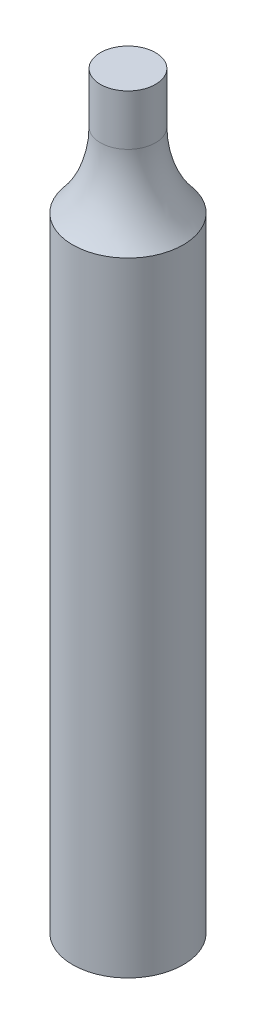
ISO-10303-21;
HEADER;
FILE_DESCRIPTION(('STEP AP214'),'2;1');
FILE_NAME('part.step','',(''),(''),'','','');
FILE_SCHEMA(('AUTOMOTIVE_DESIGN { 1 0 10303 214 1 1 1 1 }'));
ENDSEC;
DATA;
#1=APPLICATION_CONTEXT('core data for automotive mechanical design processes');
#2=APPLICATION_PROTOCOL_DEFINITION('international standard','automotive_design',2000,#1);
#3=PRODUCT_CONTEXT('',#1,'mechanical');
#4=PRODUCT('Part','Part','',(#3));
#5=PRODUCT_RELATED_PRODUCT_CATEGORY('part','',(#4));
#6=PRODUCT_DEFINITION_FORMATION('','',#4);
#7=PRODUCT_DEFINITION_CONTEXT('part definition',#1,'design');
#8=PRODUCT_DEFINITION('design','',#6,#7);
#9=PRODUCT_DEFINITION_SHAPE('','',#8);
#10=(LENGTH_UNIT() NAMED_UNIT(*) SI_UNIT(.MILLI.,.METRE.));
#11=(NAMED_UNIT(*) PLANE_ANGLE_UNIT() SI_UNIT($,.RADIAN.));
#12=(NAMED_UNIT(*) SI_UNIT($,.STERADIAN.) SOLID_ANGLE_UNIT());
#13=UNCERTAINTY_MEASURE_WITH_UNIT(LENGTH_MEASURE(1.E-05),#10,'distance_accuracy_value','');
#14=(GEOMETRIC_REPRESENTATION_CONTEXT(3) GLOBAL_UNCERTAINTY_ASSIGNED_CONTEXT((#13)) GLOBAL_UNIT_ASSIGNED_CONTEXT((#10,
#11,#12)) REPRESENTATION_CONTEXT('',''));
#15=CARTESIAN_POINT('',(0.,0.,0.));
#16=DIRECTION('',(0.,0.,1.));
#17=DIRECTION('',(1.,0.,0.));
#18=AXIS2_PLACEMENT_3D('',#15,#16,#17);
#19=CARTESIAN_POINT('',(0.,15.1558730337911,16.2870045691079));
#20=DIRECTION('',(0.,1.,0.));
#21=DIRECTION('',(0.,0.,1.));
#22=AXIS2_PLACEMENT_3D('',#19,#20,#21);
#23=PLANE('',#22);
#24=CARTESIAN_POINT('',(0.,15.1558730337911,16.2870045691079));
#25=DIRECTION('',(0.,1.,0.));
#26=DIRECTION('',(0.,0.,1.));
#27=AXIS2_PLACEMENT_3D('',#24,#25,#26);
#28=CIRCLE('',#27,5.21664899786593);
#29=CARTESIAN_POINT('',(0.,15.1558730337911,21.5036535669739));
#30=VERTEX_POINT('',#29);
#31=EDGE_CURVE('E51',#30,#30,#28,.T.);
#32=ORIENTED_EDGE('',*,*,#31,.T.);
#33=EDGE_LOOP('',(#32));
#34=FACE_BOUND('',#33,.T.);
#35=ADVANCED_FACE('F37',(#34),#23,.T.);
#36=CARTESIAN_POINT('',(0.,-126.667164195396,16.2870045691079));
#37=DIRECTION('',(0.,-1.,0.));
#38=DIRECTION('',(0.,0.,-1.));
#39=AXIS2_PLACEMENT_3D('',#36,#37,#38);
#40=PLANE('',#39);
#41=CARTESIAN_POINT('',(0.,-126.667164195396,16.2870045691079));
#42=DIRECTION('',(0.,1.,0.));
#43=DIRECTION('',(0.,0.,1.));
#44=AXIS2_PLACEMENT_3D('',#41,#42,#43);
#45=CIRCLE('',#44,10.4769396689903);
#46=CARTESIAN_POINT('',(0.,-126.667164195396,26.7639442380982));
#47=VERTEX_POINT('',#46);
#48=EDGE_CURVE('E10',#47,#47,#45,.T.);
#49=ORIENTED_EDGE('',*,*,#48,.F.);
#50=EDGE_LOOP('',(#49));
#51=FACE_BOUND('',#50,.T.);
#52=ADVANCED_FACE('F69',(#51),#40,.T.);
#53=CARTESIAN_POINT('',(0.,15.1558730337911,16.2870045691079));
#54=DIRECTION('',(0.,1.,0.));
#55=DIRECTION('',(0.,0.,1.));
#56=AXIS2_PLACEMENT_3D('',#53,#54,#55);
#57=CYLINDRICAL_SURFACE('',#56,10.4769396689903);
#58=ORIENTED_EDGE('',*,*,#48,.T.);
#59=EDGE_LOOP('',(#58));
#60=FACE_BOUND('',#59,.T.);
#61=CARTESIAN_POINT('',(0.,-8.54722199033899,16.2870045691079));
#62=DIRECTION('',(0.,1.,0.));
#63=DIRECTION('',(0.,0.,1.));
#64=AXIS2_PLACEMENT_3D('',#61,#62,#63);
#65=CIRCLE('',#64,10.4769396689903);
#66=CARTESIAN_POINT('',(0.,-8.54722199033899,26.7639442380982));
#67=VERTEX_POINT('',#66);
#68=EDGE_CURVE('E43',#67,#67,#65,.T.);
#69=ORIENTED_EDGE('',*,*,#68,.F.);
#70=EDGE_LOOP('',(#69));
#71=FACE_BOUND('',#70,.T.);
#72=ADVANCED_FACE('F66',(#60,#71),#57,.T.);
#73=CARTESIAN_POINT('',(0.,5.5702235143366,16.2870045691079));
#74=DIRECTION('',(0.,1.,0.));
#75=DIRECTION('',(0.,0.,1.));
#76=AXIS2_PLACEMENT_3D('',#73,#74,#75);
#77=TOROIDAL_SURFACE('',#76,26.7908299426699,21.574180944804);
#78=ORIENTED_EDGE('',*,*,#68,.T.);
#79=EDGE_LOOP('',(#78));
#80=FACE_BOUND('',#79,.T.);
#81=CARTESIAN_POINT('',(0.,5.5702235143366,16.2870045691079));
#82=DIRECTION('',(0.,1.,0.));
#83=DIRECTION('',(0.,0.,1.));
#84=AXIS2_PLACEMENT_3D('',#81,#82,#83);
#85=CIRCLE('',#84,5.21664899786593);
#86=CARTESIAN_POINT('',(0.,5.5702235143366,21.5036535669739));
#87=VERTEX_POINT('',#86);
#88=EDGE_CURVE('E47',#87,#87,#85,.T.);
#89=ORIENTED_EDGE('',*,*,#88,.F.);
#90=EDGE_LOOP('',(#89));
#91=FACE_BOUND('',#90,.T.);
#92=ADVANCED_FACE('F60',(#80,#91),#77,.F.);
#93=CARTESIAN_POINT('',(0.,15.1558730337911,16.2870045691079));
#94=DIRECTION('',(0.,1.,0.));
#95=DIRECTION('',(0.,0.,1.));
#96=AXIS2_PLACEMENT_3D('',#93,#94,#95);
#97=CYLINDRICAL_SURFACE('',#96,5.21664899786593);
#98=ORIENTED_EDGE('',*,*,#88,.T.);
#99=EDGE_LOOP('',(#98));
#100=FACE_BOUND('',#99,.T.);
#101=ORIENTED_EDGE('',*,*,#31,.F.);
#102=EDGE_LOOP('',(#101));
#103=FACE_BOUND('',#102,.T.);
#104=ADVANCED_FACE('F58',(#100,#103),#97,.T.);
#105=CLOSED_SHELL('',(#35,#52,#72,#92,#104));
#106=MANIFOLD_SOLID_BREP('B2',#105);
#107=ADVANCED_BREP_SHAPE_REPRESENTATION('',(#18,#106),#14);
#108=SHAPE_DEFINITION_REPRESENTATION(#9,#107);
ENDSEC;
END-ISO-10303-21;
